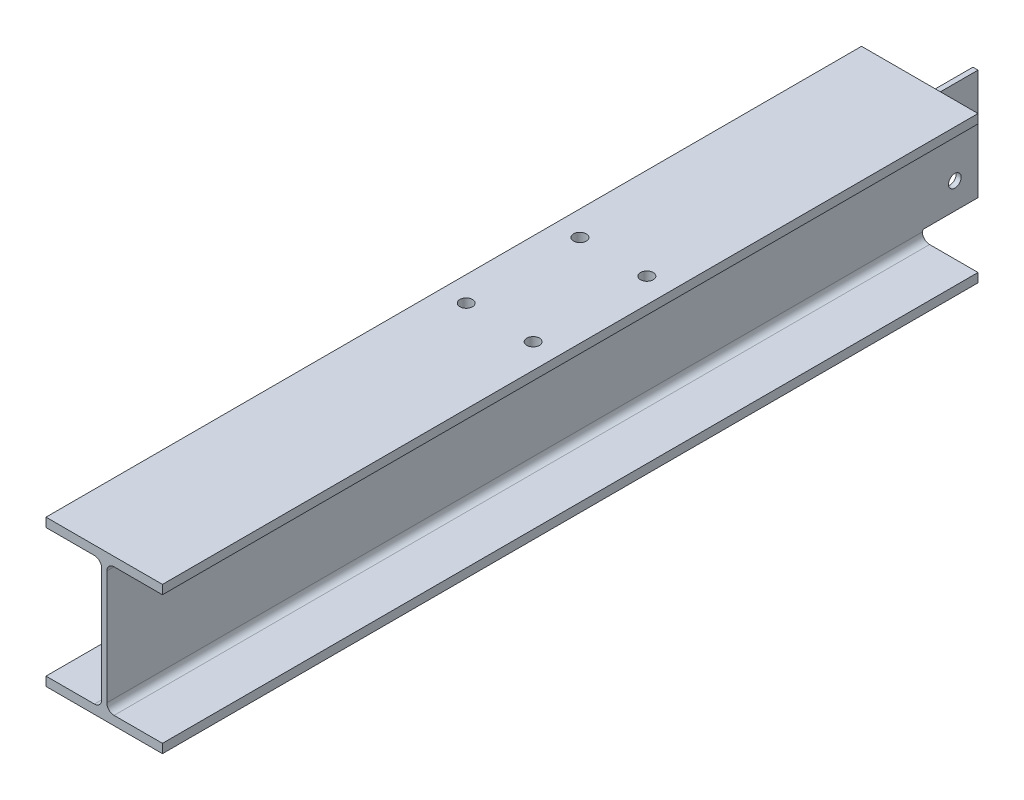
ISO-10303-21;
HEADER;
FILE_DESCRIPTION(('STEP AP214'),'2;1');
FILE_NAME('part.step','',(''),(''),'','','');
FILE_SCHEMA(('AUTOMOTIVE_DESIGN { 1 0 10303 214 1 1 1 1 }'));
ENDSEC;
DATA;
#1=APPLICATION_CONTEXT('core data for automotive mechanical design processes');
#2=APPLICATION_PROTOCOL_DEFINITION('international standard','automotive_design',2000,#1);
#3=PRODUCT_CONTEXT('',#1,'mechanical');
#4=PRODUCT('Part','Part','',(#3));
#5=PRODUCT_RELATED_PRODUCT_CATEGORY('part','',(#4));
#6=PRODUCT_DEFINITION_FORMATION('','',#4);
#7=PRODUCT_DEFINITION_CONTEXT('part definition',#1,'design');
#8=PRODUCT_DEFINITION('design','',#6,#7);
#9=PRODUCT_DEFINITION_SHAPE('','',#8);
#10=(LENGTH_UNIT() NAMED_UNIT(*) SI_UNIT(.MILLI.,.METRE.));
#11=(NAMED_UNIT(*) PLANE_ANGLE_UNIT() SI_UNIT($,.RADIAN.));
#12=(NAMED_UNIT(*) SI_UNIT($,.STERADIAN.) SOLID_ANGLE_UNIT());
#13=UNCERTAINTY_MEASURE_WITH_UNIT(LENGTH_MEASURE(1.E-05),#10,'distance_accuracy_value','');
#14=(GEOMETRIC_REPRESENTATION_CONTEXT(3) GLOBAL_UNCERTAINTY_ASSIGNED_CONTEXT((#13)) GLOBAL_UNIT_ASSIGNED_CONTEXT((#10,
#11,#12)) REPRESENTATION_CONTEXT('',''));
#15=CARTESIAN_POINT('',(0.,0.,0.));
#16=DIRECTION('',(0.,0.,1.));
#17=DIRECTION('',(1.,0.,0.));
#18=AXIS2_PLACEMENT_3D('',#15,#16,#17);
#19=CARTESIAN_POINT('',(111.974797560414,52.7493834360827,-749.430791914876));
#20=DIRECTION('',(0.,-1.,0.));
#21=DIRECTION('',(0.,0.,-1.));
#22=AXIS2_PLACEMENT_3D('',#19,#20,#21);
#23=PLANE('',#22);
#24=DIRECTION('',(0.,0.,1.));
#25=VECTOR('',#24,1.);
#26=CARTESIAN_POINT('',(-91.7332024395856,52.7493834360827,-749.430791914876));
#27=LINE('',#26,#25);
#28=CARTESIAN_POINT('',(-91.7332024395856,52.7493834360827,-652.021791914876));
#29=VERTEX_POINT('',#28);
#30=CARTESIAN_POINT('',(-91.7332024395856,52.7493834360827,774.569208085124));
#31=VERTEX_POINT('',#30);
#32=EDGE_CURVE('E199',#29,#31,#27,.T.);
#33=ORIENTED_EDGE('',*,*,#32,.F.);
#34=DIRECTION('',(-1.,0.,0.));
#35=VECTOR('',#34,1.);
#36=CARTESIAN_POINT('',(2063.17784221331,52.7493834360827,-652.021791914876));
#37=LINE('',#36,#35);
#38=CARTESIAN_POINT('',(111.974797560414,52.7493834360827,-652.021791914876));
#39=VERTEX_POINT('',#38);
#40=EDGE_CURVE('E398',#39,#29,#37,.T.);
#41=ORIENTED_EDGE('',*,*,#40,.F.);
#42=DIRECTION('',(0.,0.,1.));
#43=VECTOR('',#42,1.);
#44=CARTESIAN_POINT('',(111.974797560414,52.7493834360827,-749.430791914876));
#45=LINE('',#44,#43);
#46=CARTESIAN_POINT('',(111.974797560414,52.7493834360827,774.569208085124));
#47=VERTEX_POINT('',#46);
#48=EDGE_CURVE('E208',#39,#47,#45,.T.);
#49=ORIENTED_EDGE('',*,*,#48,.T.);
#50=DIRECTION('',(1.,0.,0.));
#51=VECTOR('',#50,1.);
#52=CARTESIAN_POINT('',(111.974797560414,52.7493834360827,774.569208085124));
#53=LINE('',#52,#51);
#54=EDGE_CURVE('E427',#31,#47,#53,.T.);
#55=ORIENTED_EDGE('',*,*,#54,.F.);
#56=EDGE_LOOP('',(#33,#41,#49,#55));
#57=FACE_BOUND('',#56,.T.);
#58=ADVANCED_FACE('F36',(#57),#23,.T.);
#59=CARTESIAN_POINT('',(-91.7332024395856,52.7493834360827,-749.430791914876));
#60=DIRECTION('',(-1.,0.,0.));
#61=DIRECTION('',(0.,-1.,0.));
#62=AXIS2_PLACEMENT_3D('',#59,#60,#61);
#63=PLANE('',#62);
#64=DIRECTION('',(0.,0.,1.));
#65=VECTOR('',#64,1.);
#66=CARTESIAN_POINT('',(-91.7332024395856,68.4973834360827,-749.430791914876));
#67=LINE('',#66,#65);
#68=CARTESIAN_POINT('',(-91.7332024395856,68.4973834360827,-652.021791914876));
#69=VERTEX_POINT('',#68);
#70=CARTESIAN_POINT('',(-91.7332024395856,68.4973834360827,774.569208085124));
#71=VERTEX_POINT('',#70);
#72=EDGE_CURVE('E204',#69,#71,#67,.T.);
#73=ORIENTED_EDGE('',*,*,#72,.F.);
#74=DIRECTION('',(0.,-1.,0.));
#75=VECTOR('',#74,1.);
#76=CARTESIAN_POINT('',(-91.7332024395856,52.7493834360823,-652.021791914876));
#77=LINE('',#76,#75);
#78=EDGE_CURVE('E413',#69,#29,#77,.T.);
#79=ORIENTED_EDGE('',*,*,#78,.T.);
#80=ORIENTED_EDGE('',*,*,#32,.T.);
#81=DIRECTION('',(0.,-1.,0.));
#82=VECTOR('',#81,1.);
#83=CARTESIAN_POINT('',(-91.7332024395856,52.7493834360827,774.569208085124));
#84=LINE('',#83,#82);
#85=EDGE_CURVE('E194',#71,#31,#84,.T.);
#86=ORIENTED_EDGE('',*,*,#85,.F.);
#87=EDGE_LOOP('',(#73,#79,#80,#86));
#88=FACE_BOUND('',#87,.T.);
#89=ADVANCED_FACE('F263',(#88),#63,.T.);
#90=CARTESIAN_POINT('',(-91.7332024395856,68.4973834360827,-749.430791914876));
#91=DIRECTION('',(0.,1.,0.));
#92=DIRECTION('',(-1.,0.,0.));
#93=AXIS2_PLACEMENT_3D('',#90,#91,#92);
#94=PLANE('',#93);
#95=DIRECTION('',(0.,0.,1.));
#96=VECTOR('',#95,1.);
#97=CARTESIAN_POINT('',(-7.02420243958561,68.4973834360827,-749.430791914876));
#98=LINE('',#97,#96);
#99=CARTESIAN_POINT('',(-7.02420243958561,68.4973834360827,-652.021791914876));
#100=VERTEX_POINT('',#99);
#101=CARTESIAN_POINT('',(-7.02420243958561,68.4973834360827,774.569208085124));
#102=VERTEX_POINT('',#101);
#103=EDGE_CURVE('E237',#100,#102,#98,.T.);
#104=ORIENTED_EDGE('',*,*,#103,.F.);
#105=DIRECTION('',(-1.,0.,0.));
#106=VECTOR('',#105,1.);
#107=CARTESIAN_POINT('',(-91.7332024395856,68.4973834360827,-652.021791914876));
#108=LINE('',#107,#106);
#109=EDGE_CURVE('E246',#100,#69,#108,.T.);
#110=ORIENTED_EDGE('',*,*,#109,.T.);
#111=ORIENTED_EDGE('',*,*,#72,.T.);
#112=DIRECTION('',(-1.,0.,0.));
#113=VECTOR('',#112,1.);
#114=CARTESIAN_POINT('',(-91.7332024395856,68.4973834360827,774.569208085124));
#115=LINE('',#114,#113);
#116=EDGE_CURVE('E468',#102,#71,#115,.T.);
#117=ORIENTED_EDGE('',*,*,#116,.F.);
#118=EDGE_LOOP('',(#104,#110,#111,#117));
#119=FACE_BOUND('',#118,.T.);
#120=ADVANCED_FACE('F268',(#119),#94,.T.);
#121=CARTESIAN_POINT('',(-7.02420243958561,81.1973834360827,-749.430791914876));
#122=DIRECTION('',(0.,0.,1.));
#123=DIRECTION('',(1.,0.,0.));
#124=AXIS2_PLACEMENT_3D('',#121,#122,#123);
#125=CYLINDRICAL_SURFACE('',#124,12.7);
#126=DIRECTION('',(0.,0.,1.));
#127=VECTOR('',#126,1.);
#128=CARTESIAN_POINT('',(5.67579756041439,81.1973834360827,-749.430791914876));
#129=LINE('',#128,#127);
#130=CARTESIAN_POINT('',(5.67579756041439,81.1973834360827,-652.021791914876));
#131=VERTEX_POINT('',#130);
#132=CARTESIAN_POINT('',(5.67579756041439,81.1973834360827,774.569208085124));
#133=VERTEX_POINT('',#132);
#134=EDGE_CURVE('E224',#131,#133,#129,.T.);
#135=ORIENTED_EDGE('',*,*,#134,.F.);
#136=CARTESIAN_POINT('',(-7.02420243958561,81.1973834360827,-652.021791914876));
#137=DIRECTION('',(0.,0.,-1.));
#138=DIRECTION('',(0.,1.,0.));
#139=AXIS2_PLACEMENT_3D('',#136,#137,#138);
#140=CIRCLE('',#139,12.7);
#141=EDGE_CURVE('E231',#131,#100,#140,.T.);
#142=ORIENTED_EDGE('',*,*,#141,.T.);
#143=ORIENTED_EDGE('',*,*,#103,.T.);
#144=CARTESIAN_POINT('',(-7.02420243958561,81.1973834360827,774.569208085124));
#145=DIRECTION('',(0.,0.,-1.));
#146=DIRECTION('',(1.,0.,0.));
#147=AXIS2_PLACEMENT_3D('',#144,#145,#146);
#148=CIRCLE('',#147,12.7);
#149=EDGE_CURVE('E234',#133,#102,#148,.T.);
#150=ORIENTED_EDGE('',*,*,#149,.F.);
#151=EDGE_LOOP('',(#135,#142,#143,#150));
#152=FACE_BOUND('',#151,.T.);
#153=ADVANCED_FACE('F230',(#152),#125,.F.);
#154=CARTESIAN_POINT('',(5.67579756041441,81.1973834360827,-749.430791914876));
#155=DIRECTION('',(-1.,0.,0.));
#156=DIRECTION('',(0.,-1.,0.));
#157=AXIS2_PLACEMENT_3D('',#154,#155,#156);
#158=PLANE('',#157);
#159=CARTESIAN_POINT('',(5.67579756041439,130.219383436083,-708.949541914876));
#160=DIRECTION('',(-1.,0.,0.));
#161=DIRECTION('',(0.,-1.,0.));
#162=AXIS2_PLACEMENT_3D('',#159,#160,#161);
#163=CIRCLE('',#162,11.1125);
#164=CARTESIAN_POINT('',(5.6757975604144,119.106883436083,-708.949541914876));
#165=VERTEX_POINT('',#164);
#166=EDGE_CURVE('E388',#165,#165,#163,.F.);
#167=ORIENTED_EDGE('',*,*,#166,.T.);
#168=EDGE_LOOP('',(#167));
#169=FACE_BOUND('',#168,.T.);
#170=CARTESIAN_POINT('',(5.67579756041435,231.819383436083,-708.949541914876));
#171=DIRECTION('',(-1.,0.,0.));
#172=DIRECTION('',(0.,-1.,0.));
#173=AXIS2_PLACEMENT_3D('',#170,#171,#172);
#174=CIRCLE('',#173,11.1125);
#175=CARTESIAN_POINT('',(5.67579756041435,220.706883436083,-708.949541914876));
#176=VERTEX_POINT('',#175);
#177=EDGE_CURVE('E392',#176,#176,#174,.F.);
#178=ORIENTED_EDGE('',*,*,#177,.T.);
#179=EDGE_LOOP('',(#178));
#180=FACE_BOUND('',#179,.T.);
#181=DIRECTION('',(0.,0.,1.));
#182=VECTOR('',#181,1.);
#183=CARTESIAN_POINT('',(5.67579756041434,280.841383436083,-749.430791914876));
#184=LINE('',#183,#182);
#185=CARTESIAN_POINT('',(5.67579756041434,280.841383436083,-652.021791914876));
#186=VERTEX_POINT('',#185);
#187=CARTESIAN_POINT('',(5.67579756041434,280.841383436083,774.569208085124));
#188=VERTEX_POINT('',#187);
#189=EDGE_CURVE('E238',#186,#188,#184,.T.);
#190=ORIENTED_EDGE('',*,*,#189,.F.);
#191=CARTESIAN_POINT('',(5.67579756041425,280.841383436083,-655.196791914876));
#192=DIRECTION('',(-1.,0.,0.));
#193=DIRECTION('',(0.,-1.,0.));
#194=AXIS2_PLACEMENT_3D('',#191,#192,#193);
#195=CIRCLE('',#194,3.175);
#196=CARTESIAN_POINT('',(5.67579756041434,277.666383436083,-655.196791914876));
#197=VERTEX_POINT('',#196);
#198=EDGE_CURVE('E44',#186,#197,#195,.F.);
#199=ORIENTED_EDGE('',*,*,#198,.T.);
#200=DIRECTION('',(0.,0.,-1.));
#201=VECTOR('',#200,1.);
#202=CARTESIAN_POINT('',(5.67579756041434,277.666383436083,-749.430791914876));
#203=LINE('',#202,#201);
#204=CARTESIAN_POINT('',(5.67579756041425,277.666383436083,-749.430791914876));
#205=VERTEX_POINT('',#204);
#206=EDGE_CURVE('E407',#197,#205,#203,.T.);
#207=ORIENTED_EDGE('',*,*,#206,.T.);
#208=DIRECTION('',(0.,-1.,0.));
#209=VECTOR('',#208,1.);
#210=CARTESIAN_POINT('',(5.67579756041441,81.1973834360827,-749.430791914876));
#211=LINE('',#210,#209);
#212=CARTESIAN_POINT('',(5.6757975604144,84.3723834360826,-749.430791914876));
#213=VERTEX_POINT('',#212);
#214=EDGE_CURVE('E193',#205,#213,#211,.T.);
#215=ORIENTED_EDGE('',*,*,#214,.T.);
#216=DIRECTION('',(0.,0.,1.));
#217=VECTOR('',#216,1.);
#218=CARTESIAN_POINT('',(5.6757975604144,84.3723834360826,-749.430791914876));
#219=LINE('',#218,#217);
#220=CARTESIAN_POINT('',(5.6757975604144,84.3723834360826,-655.196791914876));
#221=VERTEX_POINT('',#220);
#222=EDGE_CURVE('E183',#213,#221,#219,.T.);
#223=ORIENTED_EDGE('',*,*,#222,.T.);
#224=CARTESIAN_POINT('',(5.67579756041425,81.1973834360826,-655.196791914876));
#225=DIRECTION('',(-1.,0.,0.));
#226=DIRECTION('',(0.,-1.,0.));
#227=AXIS2_PLACEMENT_3D('',#224,#225,#226);
#228=CIRCLE('',#227,3.175);
#229=EDGE_CURVE('E219',#221,#131,#228,.F.);
#230=ORIENTED_EDGE('',*,*,#229,.T.);
#231=ORIENTED_EDGE('',*,*,#134,.T.);
#232=DIRECTION('',(0.,-1.,0.));
#233=VECTOR('',#232,1.);
#234=CARTESIAN_POINT('',(5.67579756041441,81.1973834360827,774.569208085124));
#235=LINE('',#234,#233);
#236=EDGE_CURVE('E465',#188,#133,#235,.T.);
#237=ORIENTED_EDGE('',*,*,#236,.F.);
#238=EDGE_LOOP('',(#190,#199,#207,#215,#223,#230,#231,#237));
#239=FACE_BOUND('',#238,.T.);
#240=ADVANCED_FACE('F222',(#169,#180,#239),#158,.T.);
#241=CARTESIAN_POINT('',(-7.02420243958567,280.841383436083,-749.430791914876));
#242=DIRECTION('',(0.,0.,1.));
#243=DIRECTION('',(1.,0.,0.));
#244=AXIS2_PLACEMENT_3D('',#241,#242,#243);
#245=CYLINDRICAL_SURFACE('',#244,12.7);
#246=DIRECTION('',(0.,0.,1.));
#247=VECTOR('',#246,1.);
#248=CARTESIAN_POINT('',(-7.02420243958565,293.541383436083,-749.430791914876));
#249=LINE('',#248,#247);
#250=CARTESIAN_POINT('',(-7.02420243958565,293.541383436083,-652.021791914876));
#251=VERTEX_POINT('',#250);
#252=CARTESIAN_POINT('',(-7.02420243958565,293.541383436083,774.569208085124));
#253=VERTEX_POINT('',#252);
#254=EDGE_CURVE('E478',#251,#253,#249,.T.);
#255=ORIENTED_EDGE('',*,*,#254,.F.);
#256=CARTESIAN_POINT('',(-7.02420243958567,280.841383436083,-652.021791914876));
#257=DIRECTION('',(0.,0.,-1.));
#258=DIRECTION('',(-1.,0.,0.));
#259=AXIS2_PLACEMENT_3D('',#256,#257,#258);
#260=CIRCLE('',#259,12.7);
#261=EDGE_CURVE('E425',#251,#186,#260,.T.);
#262=ORIENTED_EDGE('',*,*,#261,.T.);
#263=ORIENTED_EDGE('',*,*,#189,.T.);
#264=CARTESIAN_POINT('',(-7.02420243958567,280.841383436083,774.569208085124));
#265=DIRECTION('',(0.,0.,-1.));
#266=DIRECTION('',(1.,0.,0.));
#267=AXIS2_PLACEMENT_3D('',#264,#265,#266);
#268=CIRCLE('',#267,12.7);
#269=EDGE_CURVE('E462',#253,#188,#268,.T.);
#270=ORIENTED_EDGE('',*,*,#269,.F.);
#271=EDGE_LOOP('',(#255,#262,#263,#270));
#272=FACE_BOUND('',#271,.T.);
#273=ADVANCED_FACE('F311',(#272),#245,.F.);
#274=CARTESIAN_POINT('',(-7.02420243958565,293.541383436083,-749.430791914876));
#275=DIRECTION('',(0.,-1.,0.));
#276=DIRECTION('',(0.,0.,-1.));
#277=AXIS2_PLACEMENT_3D('',#274,#275,#276);
#278=PLANE('',#277);
#279=CARTESIAN_POINT('',(-48.4209722340553,293.541383436083,82.8056177634724));
#280=DIRECTION('',(0.,-1.,0.));
#281=DIRECTION('',(0.,0.,-1.));
#282=AXIS2_PLACEMENT_3D('',#279,#280,#281);
#283=CIRCLE('',#282,11.1125);
#284=CARTESIAN_POINT('',(-48.4209722340553,293.541383436083,71.6931177634724));
#285=VERTEX_POINT('',#284);
#286=EDGE_CURVE('E363',#285,#285,#283,.F.);
#287=ORIENTED_EDGE('',*,*,#286,.T.);
#288=EDGE_LOOP('',(#287));
#289=FACE_BOUND('',#288,.T.);
#290=CARTESIAN_POINT('',(-48.4209722340539,293.541383436083,-116.057955918413));
#291=DIRECTION('',(0.,-1.,0.));
#292=DIRECTION('',(0.,0.,-1.));
#293=AXIS2_PLACEMENT_3D('',#290,#291,#292);
#294=CIRCLE('',#293,11.1125);
#295=CARTESIAN_POINT('',(-48.4209722340539,293.541383436083,-127.170455918413));
#296=VERTEX_POINT('',#295);
#297=EDGE_CURVE('E376',#296,#296,#294,.F.);
#298=ORIENTED_EDGE('',*,*,#297,.T.);
#299=EDGE_LOOP('',(#298));
#300=FACE_BOUND('',#299,.T.);
#301=DIRECTION('',(0.,0.,1.));
#302=VECTOR('',#301,1.);
#303=CARTESIAN_POINT('',(-91.7332024395856,293.541383436083,-749.430791914876));
#304=LINE('',#303,#302);
#305=CARTESIAN_POINT('',(-91.7332024395856,293.541383436083,-652.021791914876));
#306=VERTEX_POINT('',#305);
#307=CARTESIAN_POINT('',(-91.7332024395856,293.541383436083,774.569208085124));
#308=VERTEX_POINT('',#307);
#309=EDGE_CURVE('E480',#306,#308,#304,.T.);
#310=ORIENTED_EDGE('',*,*,#309,.F.);
#311=DIRECTION('',(1.,0.,0.));
#312=VECTOR('',#311,1.);
#313=CARTESIAN_POINT('',(-7.02420243958565,293.541383436083,-652.021791914876));
#314=LINE('',#313,#312);
#315=EDGE_CURVE('E423',#306,#251,#314,.T.);
#316=ORIENTED_EDGE('',*,*,#315,.T.);
#317=ORIENTED_EDGE('',*,*,#254,.T.);
#318=DIRECTION('',(1.,0.,0.));
#319=VECTOR('',#318,1.);
#320=CARTESIAN_POINT('',(-7.02420243958565,293.541383436083,774.569208085124));
#321=LINE('',#320,#319);
#322=EDGE_CURVE('E459',#308,#253,#321,.T.);
#323=ORIENTED_EDGE('',*,*,#322,.F.);
#324=EDGE_LOOP('',(#310,#316,#317,#323));
#325=FACE_BOUND('',#324,.T.);
#326=ADVANCED_FACE('F307',(#289,#300,#325),#278,.T.);
#327=CARTESIAN_POINT('',(-91.7332024395856,293.541383436083,-749.430791914876));
#328=DIRECTION('',(-1.,0.,0.));
#329=DIRECTION('',(0.,-1.,0.));
#330=AXIS2_PLACEMENT_3D('',#327,#328,#329);
#331=PLANE('',#330);
#332=DIRECTION('',(0.,0.,1.));
#333=VECTOR('',#332,1.);
#334=CARTESIAN_POINT('',(-91.7332024395856,309.289383436083,-749.430791914876));
#335=LINE('',#334,#333);
#336=CARTESIAN_POINT('',(-91.7332024395856,309.289383436083,-652.021791914876));
#337=VERTEX_POINT('',#336);
#338=CARTESIAN_POINT('',(-91.7332024395856,309.289383436083,774.569208085124));
#339=VERTEX_POINT('',#338);
#340=EDGE_CURVE('E482',#337,#339,#335,.T.);
#341=ORIENTED_EDGE('',*,*,#340,.F.);
#342=DIRECTION('',(0.,-1.,0.));
#343=VECTOR('',#342,1.);
#344=CARTESIAN_POINT('',(-91.7332024395856,293.541383436083,-652.021791914876));
#345=LINE('',#344,#343);
#346=EDGE_CURVE('E421',#337,#306,#345,.T.);
#347=ORIENTED_EDGE('',*,*,#346,.T.);
#348=ORIENTED_EDGE('',*,*,#309,.T.);
#349=DIRECTION('',(0.,-1.,0.));
#350=VECTOR('',#349,1.);
#351=CARTESIAN_POINT('',(-91.7332024395856,293.541383436083,774.569208085124));
#352=LINE('',#351,#350);
#353=EDGE_CURVE('E456',#339,#308,#352,.T.);
#354=ORIENTED_EDGE('',*,*,#353,.F.);
#355=EDGE_LOOP('',(#341,#347,#348,#354));
#356=FACE_BOUND('',#355,.T.);
#357=ADVANCED_FACE('F303',(#356),#331,.T.);
#358=CARTESIAN_POINT('',(-91.7332024395856,309.289383436083,-749.430791914876));
#359=DIRECTION('',(0.,1.,0.));
#360=DIRECTION('',(0.,0.,1.));
#361=AXIS2_PLACEMENT_3D('',#358,#359,#360);
#362=PLANE('',#361);
#363=CARTESIAN_POINT('',(-48.4209722340553,309.289383436083,82.8056177634724));
#364=DIRECTION('',(0.,1.,0.));
#365=DIRECTION('',(0.,0.,1.));
#366=AXIS2_PLACEMENT_3D('',#363,#364,#365);
#367=CIRCLE('',#366,11.1125);
#368=CARTESIAN_POINT('',(-48.4209722340553,309.289383436083,93.9181177634724));
#369=VERTEX_POINT('',#368);
#370=EDGE_CURVE('E366',#369,#369,#367,.T.);
#371=ORIENTED_EDGE('',*,*,#370,.F.);
#372=EDGE_LOOP('',(#371));
#373=FACE_BOUND('',#372,.T.);
#374=CARTESIAN_POINT('',(68.66256735478,309.289383436083,82.8056177634733));
#375=DIRECTION('',(0.,1.,0.));
#376=DIRECTION('',(0.,0.,1.));
#377=AXIS2_PLACEMENT_3D('',#374,#375,#376);
#378=CIRCLE('',#377,11.1125);
#379=CARTESIAN_POINT('',(68.66256735478,309.289383436083,93.9181177634733));
#380=VERTEX_POINT('',#379);
#381=EDGE_CURVE('E370',#380,#380,#378,.T.);
#382=ORIENTED_EDGE('',*,*,#381,.F.);
#383=EDGE_LOOP('',(#382));
#384=FACE_BOUND('',#383,.T.);
#385=CARTESIAN_POINT('',(-48.4209722340539,309.289383436083,-116.057955918413));
#386=DIRECTION('',(0.,1.,0.));
#387=DIRECTION('',(0.,0.,1.));
#388=AXIS2_PLACEMENT_3D('',#385,#386,#387);
#389=CIRCLE('',#388,11.1125);
#390=CARTESIAN_POINT('',(-48.4209722340539,309.289383436083,-104.945455918413));
#391=VERTEX_POINT('',#390);
#392=EDGE_CURVE('E377',#391,#391,#389,.T.);
#393=ORIENTED_EDGE('',*,*,#392,.F.);
#394=EDGE_LOOP('',(#393));
#395=FACE_BOUND('',#394,.T.);
#396=CARTESIAN_POINT('',(68.6625673547813,309.289383436083,-116.057955918412));
#397=DIRECTION('',(0.,1.,0.));
#398=DIRECTION('',(0.,0.,1.));
#399=AXIS2_PLACEMENT_3D('',#396,#397,#398);
#400=CIRCLE('',#399,11.1125);
#401=CARTESIAN_POINT('',(68.6625673547813,309.289383436083,-104.945455918412));
#402=VERTEX_POINT('',#401);
#403=EDGE_CURVE('E385',#402,#402,#400,.T.);
#404=ORIENTED_EDGE('',*,*,#403,.F.);
#405=EDGE_LOOP('',(#404));
#406=FACE_BOUND('',#405,.T.);
#407=DIRECTION('',(0.,0.,1.));
#408=VECTOR('',#407,1.);
#409=CARTESIAN_POINT('',(111.974797560414,309.289383436083,-749.430791914876));
#410=LINE('',#409,#408);
#411=CARTESIAN_POINT('',(111.974797560414,309.289383436083,-652.021791914876));
#412=VERTEX_POINT('',#411);
#413=CARTESIAN_POINT('',(111.974797560414,309.289383436083,774.569208085124));
#414=VERTEX_POINT('',#413);
#415=EDGE_CURVE('E484',#412,#414,#410,.T.);
#416=ORIENTED_EDGE('',*,*,#415,.F.);
#417=DIRECTION('',(-1.,0.,0.));
#418=VECTOR('',#417,1.);
#419=CARTESIAN_POINT('',(2063.17784221331,309.289383436083,-652.021791914876));
#420=LINE('',#419,#418);
#421=EDGE_CURVE('E184',#412,#337,#420,.T.);
#422=ORIENTED_EDGE('',*,*,#421,.T.);
#423=ORIENTED_EDGE('',*,*,#340,.T.);
#424=DIRECTION('',(-1.,0.,0.));
#425=VECTOR('',#424,1.);
#426=CARTESIAN_POINT('',(-91.7332024395856,309.289383436083,774.569208085124));
#427=LINE('',#426,#425);
#428=EDGE_CURVE('E453',#414,#339,#427,.T.);
#429=ORIENTED_EDGE('',*,*,#428,.F.);
#430=EDGE_LOOP('',(#416,#422,#423,#429));
#431=FACE_BOUND('',#430,.T.);
#432=ADVANCED_FACE('F299',(#373,#384,#395,#406,#431),#362,.T.);
#433=CARTESIAN_POINT('',(111.974797560414,309.289383436083,-749.430791914876));
#434=DIRECTION('',(1.,0.,0.));
#435=DIRECTION('',(0.,1.,0.));
#436=AXIS2_PLACEMENT_3D('',#433,#434,#435);
#437=PLANE('',#436);
#438=DIRECTION('',(0.,0.,1.));
#439=VECTOR('',#438,1.);
#440=CARTESIAN_POINT('',(111.974797560414,293.541383436083,-749.430791914876));
#441=LINE('',#440,#439);
#442=CARTESIAN_POINT('',(111.974797560414,293.541383436083,-652.021791914876));
#443=VERTEX_POINT('',#442);
#444=CARTESIAN_POINT('',(111.974797560414,293.541383436083,774.569208085124));
#445=VERTEX_POINT('',#444);
#446=EDGE_CURVE('E486',#443,#445,#441,.T.);
#447=ORIENTED_EDGE('',*,*,#446,.F.);
#448=DIRECTION('',(0.,1.,0.));
#449=VECTOR('',#448,1.);
#450=CARTESIAN_POINT('',(111.974797560414,309.289383436083,-652.021791914876));
#451=LINE('',#450,#449);
#452=EDGE_CURVE('E419',#443,#412,#451,.T.);
#453=ORIENTED_EDGE('',*,*,#452,.T.);
#454=ORIENTED_EDGE('',*,*,#415,.T.);
#455=DIRECTION('',(0.,1.,0.));
#456=VECTOR('',#455,1.);
#457=CARTESIAN_POINT('',(111.974797560414,309.289383436083,774.569208085124));
#458=LINE('',#457,#456);
#459=EDGE_CURVE('E450',#445,#414,#458,.T.);
#460=ORIENTED_EDGE('',*,*,#459,.F.);
#461=EDGE_LOOP('',(#447,#453,#454,#460));
#462=FACE_BOUND('',#461,.T.);
#463=ADVANCED_FACE('F295',(#462),#437,.T.);
#464=CARTESIAN_POINT('',(111.974797560414,293.541383436083,-749.430791914876));
#465=DIRECTION('',(0.,-1.,0.));
#466=DIRECTION('',(0.,0.,-1.));
#467=AXIS2_PLACEMENT_3D('',#464,#465,#466);
#468=PLANE('',#467);
#469=CARTESIAN_POINT('',(68.66256735478,293.541383436083,82.8056177634733));
#470=DIRECTION('',(0.,-1.,0.));
#471=DIRECTION('',(0.,0.,-1.));
#472=AXIS2_PLACEMENT_3D('',#469,#470,#471);
#473=CIRCLE('',#472,11.1125);
#474=CARTESIAN_POINT('',(68.66256735478,293.541383436083,71.6931177634733));
#475=VERTEX_POINT('',#474);
#476=EDGE_CURVE('E367',#475,#475,#473,.F.);
#477=ORIENTED_EDGE('',*,*,#476,.T.);
#478=EDGE_LOOP('',(#477));
#479=FACE_BOUND('',#478,.T.);
#480=CARTESIAN_POINT('',(68.6625673547813,293.541383436083,-116.057955918412));
#481=DIRECTION('',(0.,-1.,0.));
#482=DIRECTION('',(0.,0.,-1.));
#483=AXIS2_PLACEMENT_3D('',#480,#481,#482);
#484=CIRCLE('',#483,11.1125);
#485=CARTESIAN_POINT('',(68.6625673547813,293.541383436083,-127.170455918412));
#486=VERTEX_POINT('',#485);
#487=EDGE_CURVE('E380',#486,#486,#484,.F.);
#488=ORIENTED_EDGE('',*,*,#487,.T.);
#489=EDGE_LOOP('',(#488));
#490=FACE_BOUND('',#489,.T.);
#491=DIRECTION('',(0.,0.,1.));
#492=VECTOR('',#491,1.);
#493=CARTESIAN_POINT('',(27.2657975604144,293.541383436083,-749.430791914876));
#494=LINE('',#493,#492);
#495=CARTESIAN_POINT('',(27.2657975604144,293.541383436083,-652.021791914876));
#496=VERTEX_POINT('',#495);
#497=CARTESIAN_POINT('',(27.2657975604144,293.541383436083,774.569208085124));
#498=VERTEX_POINT('',#497);
#499=EDGE_CURVE('E488',#496,#498,#494,.T.);
#500=ORIENTED_EDGE('',*,*,#499,.F.);
#501=DIRECTION('',(1.,0.,0.));
#502=VECTOR('',#501,1.);
#503=CARTESIAN_POINT('',(111.974797560414,293.541383436083,-652.021791914876));
#504=LINE('',#503,#502);
#505=EDGE_CURVE('E417',#496,#443,#504,.T.);
#506=ORIENTED_EDGE('',*,*,#505,.T.);
#507=ORIENTED_EDGE('',*,*,#446,.T.);
#508=DIRECTION('',(1.,0.,0.));
#509=VECTOR('',#508,1.);
#510=CARTESIAN_POINT('',(111.974797560414,293.541383436083,774.569208085124));
#511=LINE('',#510,#509);
#512=EDGE_CURVE('E447',#498,#445,#511,.T.);
#513=ORIENTED_EDGE('',*,*,#512,.F.);
#514=EDGE_LOOP('',(#500,#506,#507,#513));
#515=FACE_BOUND('',#514,.T.);
#516=ADVANCED_FACE('F291',(#479,#490,#515),#468,.T.);
#517=CARTESIAN_POINT('',(27.2657975604144,280.841383436083,-749.430791914876));
#518=DIRECTION('',(0.,0.,1.));
#519=DIRECTION('',(1.,0.,0.));
#520=AXIS2_PLACEMENT_3D('',#517,#518,#519);
#521=CYLINDRICAL_SURFACE('',#520,12.7);
#522=DIRECTION('',(0.,0.,1.));
#523=VECTOR('',#522,1.);
#524=CARTESIAN_POINT('',(14.5657975604144,280.841383436083,-749.430791914876));
#525=LINE('',#524,#523);
#526=CARTESIAN_POINT('',(14.5657975604144,280.841383436083,-652.021791914876));
#527=VERTEX_POINT('',#526);
#528=CARTESIAN_POINT('',(14.5657975604144,280.841383436083,774.569208085124));
#529=VERTEX_POINT('',#528);
#530=EDGE_CURVE('E490',#527,#529,#525,.T.);
#531=ORIENTED_EDGE('',*,*,#530,.F.);
#532=CARTESIAN_POINT('',(27.2657975604144,280.841383436083,-652.021791914876));
#533=DIRECTION('',(0.,0.,-1.));
#534=DIRECTION('',(-1.,0.,0.));
#535=AXIS2_PLACEMENT_3D('',#532,#533,#534);
#536=CIRCLE('',#535,12.7);
#537=EDGE_CURVE('E415',#527,#496,#536,.T.);
#538=ORIENTED_EDGE('',*,*,#537,.T.);
#539=ORIENTED_EDGE('',*,*,#499,.T.);
#540=CARTESIAN_POINT('',(27.2657975604144,280.841383436083,774.569208085124));
#541=DIRECTION('',(0.,0.,-1.));
#542=DIRECTION('',(1.,0.,0.));
#543=AXIS2_PLACEMENT_3D('',#540,#541,#542);
#544=CIRCLE('',#543,12.7);
#545=EDGE_CURVE('E444',#529,#498,#544,.T.);
#546=ORIENTED_EDGE('',*,*,#545,.F.);
#547=EDGE_LOOP('',(#531,#538,#539,#546));
#548=FACE_BOUND('',#547,.T.);
#549=ADVANCED_FACE('F287',(#548),#521,.F.);
#550=CARTESIAN_POINT('',(14.5657975604144,280.841383436083,-749.430791914876));
#551=DIRECTION('',(1.,0.,0.));
#552=DIRECTION('',(0.,1.,0.));
#553=AXIS2_PLACEMENT_3D('',#550,#551,#552);
#554=PLANE('',#553);
#555=CARTESIAN_POINT('',(14.5657975604144,130.219383436083,-708.949541914876));
#556=DIRECTION('',(1.,0.,0.));
#557=DIRECTION('',(0.,1.,0.));
#558=AXIS2_PLACEMENT_3D('',#555,#556,#557);
#559=CIRCLE('',#558,11.1125);
#560=CARTESIAN_POINT('',(14.5657975604144,141.331883436083,-708.949541914876));
#561=VERTEX_POINT('',#560);
#562=EDGE_CURVE('E389',#561,#561,#559,.T.);
#563=ORIENTED_EDGE('',*,*,#562,.F.);
#564=EDGE_LOOP('',(#563));
#565=FACE_BOUND('',#564,.T.);
#566=CARTESIAN_POINT('',(14.5657975604144,231.819383436083,-708.949541914876));
#567=DIRECTION('',(1.,0.,0.));
#568=DIRECTION('',(0.,1.,0.));
#569=AXIS2_PLACEMENT_3D('',#566,#567,#568);
#570=CIRCLE('',#569,11.1125);
#571=CARTESIAN_POINT('',(14.5657975604144,242.931883436083,-708.949541914876));
#572=VERTEX_POINT('',#571);
#573=EDGE_CURVE('E395',#572,#572,#570,.T.);
#574=ORIENTED_EDGE('',*,*,#573,.F.);
#575=EDGE_LOOP('',(#574));
#576=FACE_BOUND('',#575,.T.);
#577=DIRECTION('',(0.,0.,1.));
#578=VECTOR('',#577,1.);
#579=CARTESIAN_POINT('',(14.5657975604144,277.666383436083,-749.430791914876));
#580=LINE('',#579,#578);
#581=CARTESIAN_POINT('',(14.5657975604144,277.666383436083,-749.430791914876));
#582=VERTEX_POINT('',#581);
#583=CARTESIAN_POINT('',(14.5657975604144,277.666383436083,-655.196791914876));
#584=VERTEX_POINT('',#583);
#585=EDGE_CURVE('E405',#582,#584,#580,.T.);
#586=ORIENTED_EDGE('',*,*,#585,.T.);
#587=CARTESIAN_POINT('',(14.5657975604143,280.841383436083,-655.196791914876));
#588=DIRECTION('',(1.,0.,0.));
#589=DIRECTION('',(0.,1.,0.));
#590=AXIS2_PLACEMENT_3D('',#587,#588,#589);
#591=CIRCLE('',#590,3.175);
#592=EDGE_CURVE('E11',#584,#527,#591,.F.);
#593=ORIENTED_EDGE('',*,*,#592,.T.);
#594=ORIENTED_EDGE('',*,*,#530,.T.);
#595=DIRECTION('',(0.,1.,0.));
#596=VECTOR('',#595,1.);
#597=CARTESIAN_POINT('',(14.5657975604144,280.841383436083,774.569208085124));
#598=LINE('',#597,#596);
#599=CARTESIAN_POINT('',(14.5657975604144,81.1973834360827,774.569208085124));
#600=VERTEX_POINT('',#599);
#601=EDGE_CURVE('E441',#600,#529,#598,.T.);
#602=ORIENTED_EDGE('',*,*,#601,.F.);
#603=DIRECTION('',(0.,0.,1.));
#604=VECTOR('',#603,1.);
#605=CARTESIAN_POINT('',(14.5657975604144,81.1973834360827,-749.430791914876));
#606=LINE('',#605,#604);
#607=CARTESIAN_POINT('',(14.5657975604144,81.1973834360827,-652.021791914876));
#608=VERTEX_POINT('',#607);
#609=EDGE_CURVE('E492',#608,#600,#606,.T.);
#610=ORIENTED_EDGE('',*,*,#609,.F.);
#611=CARTESIAN_POINT('',(14.5657975604143,81.1973834360826,-655.196791914876));
#612=DIRECTION('',(1.,0.,0.));
#613=DIRECTION('',(0.,1.,0.));
#614=AXIS2_PLACEMENT_3D('',#611,#612,#613);
#615=CIRCLE('',#614,3.175);
#616=CARTESIAN_POINT('',(14.5657975604144,84.3723834360826,-655.196791914876));
#617=VERTEX_POINT('',#616);
#618=EDGE_CURVE('E178',#608,#617,#615,.F.);
#619=ORIENTED_EDGE('',*,*,#618,.T.);
#620=DIRECTION('',(0.,0.,-1.));
#621=VECTOR('',#620,1.);
#622=CARTESIAN_POINT('',(14.5657975604144,84.3723834360826,-749.430791914876));
#623=LINE('',#622,#621);
#624=CARTESIAN_POINT('',(14.5657975604143,84.3723834360826,-749.430791914876));
#625=VERTEX_POINT('',#624);
#626=EDGE_CURVE('E172',#617,#625,#623,.T.);
#627=ORIENTED_EDGE('',*,*,#626,.T.);
#628=DIRECTION('',(0.,1.,0.));
#629=VECTOR('',#628,1.);
#630=CARTESIAN_POINT('',(14.5657975604144,280.841383436083,-749.430791914876));
#631=LINE('',#630,#629);
#632=EDGE_CURVE('E175',#625,#582,#631,.T.);
#633=ORIENTED_EDGE('',*,*,#632,.T.);
#634=EDGE_LOOP('',(#586,#593,#594,#602,#610,#619,#627,#633));
#635=FACE_BOUND('',#634,.T.);
#636=ADVANCED_FACE('F174',(#565,#576,#635),#554,.T.);
#637=CARTESIAN_POINT('',(27.2657975604144,81.1973834360827,-749.430791914876));
#638=DIRECTION('',(0.,0.,1.));
#639=DIRECTION('',(1.,0.,0.));
#640=AXIS2_PLACEMENT_3D('',#637,#638,#639);
#641=CYLINDRICAL_SURFACE('',#640,12.7);
#642=DIRECTION('',(0.,0.,1.));
#643=VECTOR('',#642,1.);
#644=CARTESIAN_POINT('',(27.2657975604144,68.4973834360827,-749.430791914876));
#645=LINE('',#644,#643);
#646=CARTESIAN_POINT('',(27.2657975604144,68.4973834360827,-652.021791914876));
#647=VERTEX_POINT('',#646);
#648=CARTESIAN_POINT('',(27.2657975604144,68.4973834360827,774.569208085124));
#649=VERTEX_POINT('',#648);
#650=EDGE_CURVE('E495',#647,#649,#645,.T.);
#651=ORIENTED_EDGE('',*,*,#650,.F.);
#652=CARTESIAN_POINT('',(27.2657975604144,81.1973834360827,-652.021791914876));
#653=DIRECTION('',(0.,0.,-1.));
#654=DIRECTION('',(0.,1.,0.));
#655=AXIS2_PLACEMENT_3D('',#652,#653,#654);
#656=CIRCLE('',#655,12.7);
#657=EDGE_CURVE('E247',#647,#608,#656,.T.);
#658=ORIENTED_EDGE('',*,*,#657,.T.);
#659=ORIENTED_EDGE('',*,*,#609,.T.);
#660=CARTESIAN_POINT('',(27.2657975604144,81.1973834360827,774.569208085124));
#661=DIRECTION('',(0.,0.,-1.));
#662=DIRECTION('',(1.,0.,0.));
#663=AXIS2_PLACEMENT_3D('',#660,#661,#662);
#664=CIRCLE('',#663,12.7);
#665=EDGE_CURVE('E438',#649,#600,#664,.T.);
#666=ORIENTED_EDGE('',*,*,#665,.F.);
#667=EDGE_LOOP('',(#651,#658,#659,#666));
#668=FACE_BOUND('',#667,.T.);
#669=ADVANCED_FACE('F280',(#668),#641,.F.);
#670=CARTESIAN_POINT('',(27.2657975604144,68.4973834360827,-749.430791914876));
#671=DIRECTION('',(0.,1.,0.));
#672=DIRECTION('',(-1.,0.,0.));
#673=AXIS2_PLACEMENT_3D('',#670,#671,#672);
#674=PLANE('',#673);
#675=DIRECTION('',(0.,0.,1.));
#676=VECTOR('',#675,1.);
#677=CARTESIAN_POINT('',(111.974797560414,68.4973834360827,-749.430791914876));
#678=LINE('',#677,#676);
#679=CARTESIAN_POINT('',(111.974797560414,68.4973834360827,-652.021791914876));
#680=VERTEX_POINT('',#679);
#681=CARTESIAN_POINT('',(111.974797560414,68.4973834360827,774.569208085124));
#682=VERTEX_POINT('',#681);
#683=EDGE_CURVE('E497',#680,#682,#678,.T.);
#684=ORIENTED_EDGE('',*,*,#683,.F.);
#685=DIRECTION('',(-1.,0.,0.));
#686=VECTOR('',#685,1.);
#687=CARTESIAN_POINT('',(27.2657975604144,68.4973834360827,-652.021791914876));
#688=LINE('',#687,#686);
#689=EDGE_CURVE('E409',#680,#647,#688,.T.);
#690=ORIENTED_EDGE('',*,*,#689,.T.);
#691=ORIENTED_EDGE('',*,*,#650,.T.);
#692=DIRECTION('',(-1.,0.,0.));
#693=VECTOR('',#692,1.);
#694=CARTESIAN_POINT('',(27.2657975604144,68.4973834360827,774.569208085124));
#695=LINE('',#694,#693);
#696=EDGE_CURVE('E435',#682,#649,#695,.T.);
#697=ORIENTED_EDGE('',*,*,#696,.F.);
#698=EDGE_LOOP('',(#684,#690,#691,#697));
#699=FACE_BOUND('',#698,.T.);
#700=ADVANCED_FACE('F276',(#699),#674,.T.);
#701=CARTESIAN_POINT('',(111.974797560414,68.4973834360827,-749.430791914876));
#702=DIRECTION('',(1.,0.,0.));
#703=DIRECTION('',(0.,0.,-1.));
#704=AXIS2_PLACEMENT_3D('',#701,#702,#703);
#705=PLANE('',#704);
#706=ORIENTED_EDGE('',*,*,#48,.F.);
#707=DIRECTION('',(0.,1.,0.));
#708=VECTOR('',#707,1.);
#709=CARTESIAN_POINT('',(111.974797560414,68.4973834360823,-652.021791914876));
#710=LINE('',#709,#708);
#711=EDGE_CURVE('E201',#39,#680,#710,.T.);
#712=ORIENTED_EDGE('',*,*,#711,.T.);
#713=ORIENTED_EDGE('',*,*,#683,.T.);
#714=DIRECTION('',(0.,1.,0.));
#715=VECTOR('',#714,1.);
#716=CARTESIAN_POINT('',(111.974797560414,68.4973834360827,774.569208085124));
#717=LINE('',#716,#715);
#718=EDGE_CURVE('E432',#47,#682,#717,.T.);
#719=ORIENTED_EDGE('',*,*,#718,.F.);
#720=EDGE_LOOP('',(#706,#712,#713,#719));
#721=FACE_BOUND('',#720,.T.);
#722=ADVANCED_FACE('F273',(#721),#705,.T.);
#723=CARTESIAN_POINT('',(-7.02420243958561,81.1973834360827,-749.430791914876));
#724=DIRECTION('',(0.,0.,1.));
#725=DIRECTION('',(1.,0.,0.));
#726=AXIS2_PLACEMENT_3D('',#723,#724,#725);
#727=PLANE('',#726);
#728=DIRECTION('',(-1.,0.,0.));
#729=VECTOR('',#728,1.);
#730=CARTESIAN_POINT('',(2063.17784221331,277.666383436083,-749.430791914876));
#731=LINE('',#730,#729);
#732=EDGE_CURVE('E192',#582,#205,#731,.T.);
#733=ORIENTED_EDGE('',*,*,#732,.F.);
#734=ORIENTED_EDGE('',*,*,#632,.F.);
#735=DIRECTION('',(1.,0.,0.));
#736=VECTOR('',#735,1.);
#737=CARTESIAN_POINT('',(-7.02420243958561,84.3723834360826,-749.430791914876));
#738=LINE('',#737,#736);
#739=EDGE_CURVE('E189',#213,#625,#738,.T.);
#740=ORIENTED_EDGE('',*,*,#739,.F.);
#741=ORIENTED_EDGE('',*,*,#214,.F.);
#742=EDGE_LOOP('',(#733,#734,#740,#741));
#743=FACE_BOUND('',#742,.T.);
#744=ADVANCED_FACE('F187',(#743),#727,.F.);
#745=CARTESIAN_POINT('',(-7.02420243958561,81.1973834360827,774.569208085124));
#746=DIRECTION('',(0.,0.,1.));
#747=DIRECTION('',(1.,0.,0.));
#748=AXIS2_PLACEMENT_3D('',#745,#746,#747);
#749=PLANE('',#748);
#750=ORIENTED_EDGE('',*,*,#54,.T.);
#751=ORIENTED_EDGE('',*,*,#718,.T.);
#752=ORIENTED_EDGE('',*,*,#696,.T.);
#753=ORIENTED_EDGE('',*,*,#665,.T.);
#754=ORIENTED_EDGE('',*,*,#601,.T.);
#755=ORIENTED_EDGE('',*,*,#545,.T.);
#756=ORIENTED_EDGE('',*,*,#512,.T.);
#757=ORIENTED_EDGE('',*,*,#459,.T.);
#758=ORIENTED_EDGE('',*,*,#428,.T.);
#759=ORIENTED_EDGE('',*,*,#353,.T.);
#760=ORIENTED_EDGE('',*,*,#322,.T.);
#761=ORIENTED_EDGE('',*,*,#269,.T.);
#762=ORIENTED_EDGE('',*,*,#236,.T.);
#763=ORIENTED_EDGE('',*,*,#149,.T.);
#764=ORIENTED_EDGE('',*,*,#116,.T.);
#765=ORIENTED_EDGE('',*,*,#85,.T.);
#766=EDGE_LOOP('',(#750,#751,#752,#753,#754,#755,#756,#757,#758,#759,#760,#761,#762,#763,#764,#765));
#767=FACE_BOUND('',#766,.T.);
#768=ADVANCED_FACE('F324',(#767),#749,.T.);
#769=CARTESIAN_POINT('',(2063.17784221331,84.3723834360826,-749.430791914876));
#770=DIRECTION('',(0.,-1.,0.));
#771=DIRECTION('',(0.,0.,-1.));
#772=AXIS2_PLACEMENT_3D('',#769,#770,#771);
#773=PLANE('',#772);
#774=ORIENTED_EDGE('',*,*,#626,.F.);
#775=DIRECTION('',(-1.,0.,0.));
#776=VECTOR('',#775,1.);
#777=CARTESIAN_POINT('',(5.67579756041425,84.3723834360826,-655.196791914876));
#778=LINE('',#777,#776);
#779=EDGE_CURVE('E211',#617,#221,#778,.T.);
#780=ORIENTED_EDGE('',*,*,#779,.T.);
#781=ORIENTED_EDGE('',*,*,#222,.F.);
#782=ORIENTED_EDGE('',*,*,#739,.T.);
#783=EDGE_LOOP('',(#774,#780,#781,#782));
#784=FACE_BOUND('',#783,.T.);
#785=ADVANCED_FACE('F197',(#784),#773,.T.);
#786=CARTESIAN_POINT('',(2063.17784221331,84.3723834360826,-652.021791914876));
#787=DIRECTION('',(0.,0.,-1.));
#788=DIRECTION('',(0.,1.,0.));
#789=AXIS2_PLACEMENT_3D('',#786,#787,#788);
#790=PLANE('',#789);
#791=ORIENTED_EDGE('',*,*,#141,.F.);
#792=DIRECTION('',(-1.,0.,0.));
#793=VECTOR('',#792,1.);
#794=CARTESIAN_POINT('',(14.5657975604143,81.1973834360826,-652.021791914876));
#795=LINE('',#794,#793);
#796=EDGE_CURVE('E213',#131,#608,#795,.F.);
#797=ORIENTED_EDGE('',*,*,#796,.T.);
#798=ORIENTED_EDGE('',*,*,#657,.F.);
#799=ORIENTED_EDGE('',*,*,#689,.F.);
#800=ORIENTED_EDGE('',*,*,#711,.F.);
#801=ORIENTED_EDGE('',*,*,#40,.T.);
#802=ORIENTED_EDGE('',*,*,#78,.F.);
#803=ORIENTED_EDGE('',*,*,#109,.F.);
#804=EDGE_LOOP('',(#791,#797,#798,#799,#800,#801,#802,#803));
#805=FACE_BOUND('',#804,.T.);
#806=ADVANCED_FACE('F242',(#805),#790,.T.);
#807=CARTESIAN_POINT('',(2063.17784221331,309.289383436083,-652.021791914876));
#808=DIRECTION('',(0.,0.,-1.));
#809=DIRECTION('',(-1.,0.,0.));
#810=AXIS2_PLACEMENT_3D('',#807,#808,#809);
#811=PLANE('',#810);
#812=ORIENTED_EDGE('',*,*,#537,.F.);
#813=DIRECTION('',(-1.,0.,0.));
#814=VECTOR('',#813,1.);
#815=CARTESIAN_POINT('',(5.67579756041425,280.841383436083,-652.021791914876));
#816=LINE('',#815,#814);
#817=EDGE_CURVE('E215',#527,#186,#816,.T.);
#818=ORIENTED_EDGE('',*,*,#817,.T.);
#819=ORIENTED_EDGE('',*,*,#261,.F.);
#820=ORIENTED_EDGE('',*,*,#315,.F.);
#821=ORIENTED_EDGE('',*,*,#346,.F.);
#822=ORIENTED_EDGE('',*,*,#421,.F.);
#823=ORIENTED_EDGE('',*,*,#452,.F.);
#824=ORIENTED_EDGE('',*,*,#505,.F.);
#825=EDGE_LOOP('',(#812,#818,#819,#820,#821,#822,#823,#824));
#826=FACE_BOUND('',#825,.T.);
#827=ADVANCED_FACE('F330',(#826),#811,.T.);
#828=CARTESIAN_POINT('',(2063.17784221331,277.666383436083,-652.021791914876));
#829=DIRECTION('',(0.,1.,0.));
#830=DIRECTION('',(0.,0.,1.));
#831=AXIS2_PLACEMENT_3D('',#828,#829,#830);
#832=PLANE('',#831);
#833=ORIENTED_EDGE('',*,*,#206,.F.);
#834=DIRECTION('',(-1.,0.,0.));
#835=VECTOR('',#834,1.);
#836=CARTESIAN_POINT('',(14.5657975604143,277.666383436083,-655.196791914876));
#837=LINE('',#836,#835);
#838=EDGE_CURVE('E51',#197,#584,#837,.F.);
#839=ORIENTED_EDGE('',*,*,#838,.T.);
#840=ORIENTED_EDGE('',*,*,#585,.F.);
#841=ORIENTED_EDGE('',*,*,#732,.T.);
#842=EDGE_LOOP('',(#833,#839,#840,#841));
#843=FACE_BOUND('',#842,.T.);
#844=ADVANCED_FACE('F333',(#843),#832,.T.);
#845=CARTESIAN_POINT('',(-91.7342024395857,231.819383436083,-708.949541914876));
#846=DIRECTION('',(1.,0.,0.));
#847=DIRECTION('',(0.,1.,0.));
#848=AXIS2_PLACEMENT_3D('',#845,#846,#847);
#849=CYLINDRICAL_SURFACE('',#848,11.1125);
#850=ORIENTED_EDGE('',*,*,#177,.F.);
#851=EDGE_LOOP('',(#850));
#852=FACE_BOUND('',#851,.T.);
#853=ORIENTED_EDGE('',*,*,#573,.T.);
#854=EDGE_LOOP('',(#853));
#855=FACE_BOUND('',#854,.T.);
#856=ADVANCED_FACE('F258',(#852,#855),#849,.F.);
#857=CARTESIAN_POINT('',(-91.7342024395856,130.219383436083,-708.949541914876));
#858=DIRECTION('',(1.,0.,0.));
#859=DIRECTION('',(0.,1.,0.));
#860=AXIS2_PLACEMENT_3D('',#857,#858,#859);
#861=CYLINDRICAL_SURFACE('',#860,11.1125);
#862=ORIENTED_EDGE('',*,*,#166,.F.);
#863=EDGE_LOOP('',(#862));
#864=FACE_BOUND('',#863,.T.);
#865=ORIENTED_EDGE('',*,*,#562,.T.);
#866=EDGE_LOOP('',(#865));
#867=FACE_BOUND('',#866,.T.);
#868=ADVANCED_FACE('F251',(#864,#867),#861,.F.);
#869=CARTESIAN_POINT('',(2063.17784221331,81.1973834360826,-655.196791914876));
#870=DIRECTION('',(1.,0.,0.));
#871=DIRECTION('',(0.,0.,-1.));
#872=AXIS2_PLACEMENT_3D('',#869,#870,#871);
#873=CYLINDRICAL_SURFACE('',#872,3.175);
#874=ORIENTED_EDGE('',*,*,#618,.F.);
#875=ORIENTED_EDGE('',*,*,#796,.F.);
#876=ORIENTED_EDGE('',*,*,#229,.F.);
#877=ORIENTED_EDGE('',*,*,#779,.F.);
#878=EDGE_LOOP('',(#874,#875,#876,#877));
#879=FACE_BOUND('',#878,.T.);
#880=ADVANCED_FACE('F249',(#879),#873,.F.);
#881=CARTESIAN_POINT('',(2063.17784221331,280.841383436083,-655.196791914876));
#882=DIRECTION('',(1.,0.,0.));
#883=DIRECTION('',(0.,0.,-1.));
#884=AXIS2_PLACEMENT_3D('',#881,#882,#883);
#885=CYLINDRICAL_SURFACE('',#884,3.175);
#886=ORIENTED_EDGE('',*,*,#592,.F.);
#887=ORIENTED_EDGE('',*,*,#838,.F.);
#888=ORIENTED_EDGE('',*,*,#198,.F.);
#889=ORIENTED_EDGE('',*,*,#817,.F.);
#890=EDGE_LOOP('',(#886,#887,#888,#889));
#891=FACE_BOUND('',#890,.T.);
#892=ADVANCED_FACE('F38',(#891),#885,.F.);
#893=CARTESIAN_POINT('',(68.6625673547813,52.7483834360827,-116.057955918412));
#894=DIRECTION('',(0.,1.,0.));
#895=DIRECTION('',(0.,0.,1.));
#896=AXIS2_PLACEMENT_3D('',#893,#894,#895);
#897=CYLINDRICAL_SURFACE('',#896,11.1125);
#898=ORIENTED_EDGE('',*,*,#487,.F.);
#899=EDGE_LOOP('',(#898));
#900=FACE_BOUND('',#899,.T.);
#901=ORIENTED_EDGE('',*,*,#403,.T.);
#902=EDGE_LOOP('',(#901));
#903=FACE_BOUND('',#902,.T.);
#904=ADVANCED_FACE('F256',(#900,#903),#897,.F.);
#905=CARTESIAN_POINT('',(-48.4209722340539,52.7483834360827,-116.057955918413));
#906=DIRECTION('',(0.,1.,0.));
#907=DIRECTION('',(0.,0.,1.));
#908=AXIS2_PLACEMENT_3D('',#905,#906,#907);
#909=CYLINDRICAL_SURFACE('',#908,11.1125);
#910=ORIENTED_EDGE('',*,*,#297,.F.);
#911=EDGE_LOOP('',(#910));
#912=FACE_BOUND('',#911,.T.);
#913=ORIENTED_EDGE('',*,*,#392,.T.);
#914=EDGE_LOOP('',(#913));
#915=FACE_BOUND('',#914,.T.);
#916=ADVANCED_FACE('F346',(#912,#915),#909,.F.);
#917=CARTESIAN_POINT('',(68.66256735478,52.7483834360827,82.8056177634733));
#918=DIRECTION('',(0.,1.,0.));
#919=DIRECTION('',(0.,0.,1.));
#920=AXIS2_PLACEMENT_3D('',#917,#918,#919);
#921=CYLINDRICAL_SURFACE('',#920,11.1125);
#922=ORIENTED_EDGE('',*,*,#476,.F.);
#923=EDGE_LOOP('',(#922));
#924=FACE_BOUND('',#923,.T.);
#925=ORIENTED_EDGE('',*,*,#381,.T.);
#926=EDGE_LOOP('',(#925));
#927=FACE_BOUND('',#926,.T.);
#928=ADVANCED_FACE('F350',(#924,#927),#921,.F.);
#929=CARTESIAN_POINT('',(-48.4209722340553,52.7483834360827,82.8056177634724));
#930=DIRECTION('',(0.,1.,0.));
#931=DIRECTION('',(0.,0.,1.));
#932=AXIS2_PLACEMENT_3D('',#929,#930,#931);
#933=CYLINDRICAL_SURFACE('',#932,11.1125);
#934=ORIENTED_EDGE('',*,*,#286,.F.);
#935=EDGE_LOOP('',(#934));
#936=FACE_BOUND('',#935,.T.);
#937=ORIENTED_EDGE('',*,*,#370,.T.);
#938=EDGE_LOOP('',(#937));
#939=FACE_BOUND('',#938,.T.);
#940=ADVANCED_FACE('F354',(#936,#939),#933,.F.);
#941=CLOSED_SHELL('',(#58,#89,#120,#153,#240,#273,#326,#357,#432,#463,#516,#549,#636,#669,#700,
#722,#744,#768,#785,#806,#827,#844,#856,#868,#880,#892,#904,#916,#928,#940));
#942=MANIFOLD_SOLID_BREP('B2',#941);
#943=ADVANCED_BREP_SHAPE_REPRESENTATION('',(#18,#942),#14);
#944=SHAPE_DEFINITION_REPRESENTATION(#9,#943);
ENDSEC;
END-ISO-10303-21;
